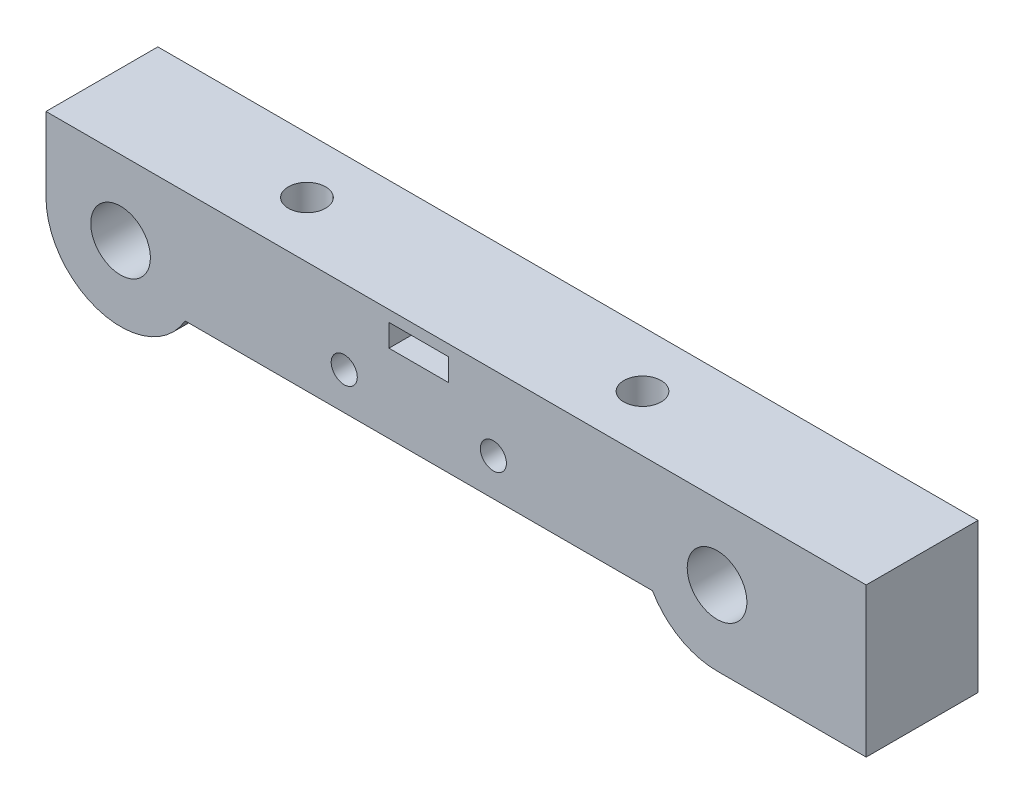
ISO-10303-21;
HEADER;
FILE_DESCRIPTION(('STEP AP214'),'2;1');
FILE_NAME('part.step','',(''),(''),'','','');
FILE_SCHEMA(('AUTOMOTIVE_DESIGN { 1 0 10303 214 1 1 1 1 }'));
ENDSEC;
DATA;
#1=APPLICATION_CONTEXT('core data for automotive mechanical design processes');
#2=APPLICATION_PROTOCOL_DEFINITION('international standard','automotive_design',2000,#1);
#3=PRODUCT_CONTEXT('',#1,'mechanical');
#4=PRODUCT('Part','Part','',(#3));
#5=PRODUCT_RELATED_PRODUCT_CATEGORY('part','',(#4));
#6=PRODUCT_DEFINITION_FORMATION('','',#4);
#7=PRODUCT_DEFINITION_CONTEXT('part definition',#1,'design');
#8=PRODUCT_DEFINITION('design','',#6,#7);
#9=PRODUCT_DEFINITION_SHAPE('','',#8);
#10=(LENGTH_UNIT() NAMED_UNIT(*) SI_UNIT(.MILLI.,.METRE.));
#11=(NAMED_UNIT(*) PLANE_ANGLE_UNIT() SI_UNIT($,.RADIAN.));
#12=(NAMED_UNIT(*) SI_UNIT($,.STERADIAN.) SOLID_ANGLE_UNIT());
#13=UNCERTAINTY_MEASURE_WITH_UNIT(LENGTH_MEASURE(1.E-05),#10,'distance_accuracy_value','');
#14=(GEOMETRIC_REPRESENTATION_CONTEXT(3) GLOBAL_UNCERTAINTY_ASSIGNED_CONTEXT((#13)) GLOBAL_UNIT_ASSIGNED_CONTEXT((#10,
#11,#12)) REPRESENTATION_CONTEXT('',''));
#15=CARTESIAN_POINT('',(0.,0.,0.));
#16=DIRECTION('',(0.,0.,1.));
#17=DIRECTION('',(1.,0.,0.));
#18=AXIS2_PLACEMENT_3D('',#15,#16,#17);
#19=CARTESIAN_POINT('',(40.,-9.99999999999999,15.));
#20=DIRECTION('',(0.,0.,-1.));
#21=DIRECTION('',(-1.,0.,0.));
#22=AXIS2_PLACEMENT_3D('',#19,#20,#21);
#23=PLANE('',#22);
#24=DIRECTION('',(-1.,0.,0.));
#25=VECTOR('',#24,1.);
#26=CARTESIAN_POINT('',(50.,0.,15.));
#27=LINE('',#26,#25);
#28=CARTESIAN_POINT('',(60.,0.,15.));
#29=VERTEX_POINT('',#28);
#30=CARTESIAN_POINT('',(-50.,0.,15.));
#31=VERTEX_POINT('',#30);
#32=EDGE_CURVE('E155',#29,#31,#27,.T.);
#33=ORIENTED_EDGE('',*,*,#32,.T.);
#34=DIRECTION('',(0.,-1.,0.));
#35=VECTOR('',#34,1.);
#36=CARTESIAN_POINT('',(-50.,-10.,15.));
#37=LINE('',#36,#35);
#38=CARTESIAN_POINT('',(-50.,-10.,15.));
#39=VERTEX_POINT('',#38);
#40=EDGE_CURVE('E157',#31,#39,#37,.T.);
#41=ORIENTED_EDGE('',*,*,#40,.T.);
#42=CARTESIAN_POINT('',(-40.,-10.,15.));
#43=DIRECTION('',(0.,0.,1.));
#44=DIRECTION('',(1.,0.,0.));
#45=AXIS2_PLACEMENT_3D('',#42,#43,#44);
#46=CIRCLE('',#45,10.);
#47=CARTESIAN_POINT('',(-31.3397459621556,-15.,15.));
#48=VERTEX_POINT('',#47);
#49=EDGE_CURVE('E160',#39,#48,#46,.T.);
#50=ORIENTED_EDGE('',*,*,#49,.T.);
#51=DIRECTION('',(1.,0.,0.));
#52=VECTOR('',#51,1.);
#53=CARTESIAN_POINT('',(-31.3397459621556,-15.,15.));
#54=LINE('',#53,#52);
#55=CARTESIAN_POINT('',(31.3397459621556,-15.,15.));
#56=VERTEX_POINT('',#55);
#57=EDGE_CURVE('E162',#48,#56,#54,.T.);
#58=ORIENTED_EDGE('',*,*,#57,.T.);
#59=CARTESIAN_POINT('',(40.,-9.99999999999999,15.));
#60=DIRECTION('',(0.,0.,1.));
#61=DIRECTION('',(-1.,0.,0.));
#62=AXIS2_PLACEMENT_3D('',#59,#60,#61);
#63=CIRCLE('',#62,10.);
#64=CARTESIAN_POINT('',(40.,-20.,15.));
#65=VERTEX_POINT('',#64);
#66=EDGE_CURVE('E164',#56,#65,#63,.T.);
#67=ORIENTED_EDGE('',*,*,#66,.T.);
#68=DIRECTION('',(1.,0.,0.));
#69=VECTOR('',#68,1.);
#70=CARTESIAN_POINT('',(60.,-20.,15.));
#71=LINE('',#70,#69);
#72=CARTESIAN_POINT('',(60.,-20.,15.));
#73=VERTEX_POINT('',#72);
#74=EDGE_CURVE('E166',#65,#73,#71,.T.);
#75=ORIENTED_EDGE('',*,*,#74,.T.);
#76=DIRECTION('',(0.,1.,0.));
#77=VECTOR('',#76,1.);
#78=CARTESIAN_POINT('',(60.,0.,15.));
#79=LINE('',#78,#77);
#80=EDGE_CURVE('E168',#73,#29,#79,.T.);
#81=ORIENTED_EDGE('',*,*,#80,.T.);
#82=EDGE_LOOP('',(#33,#41,#50,#58,#67,#75,#81));
#83=FACE_BOUND('',#82,.T.);
#84=DIRECTION('',(0.,-1.,0.));
#85=VECTOR('',#84,1.);
#86=CARTESIAN_POINT('',(-4.,-1.5,15.));
#87=LINE('',#86,#85);
#88=CARTESIAN_POINT('',(-4.,-1.5,15.));
#89=VERTEX_POINT('',#88);
#90=CARTESIAN_POINT('',(-4.,-4.5,15.));
#91=VERTEX_POINT('',#90);
#92=EDGE_CURVE('E116',#89,#91,#87,.T.);
#93=ORIENTED_EDGE('',*,*,#92,.F.);
#94=DIRECTION('',(-1.,0.,0.));
#95=VECTOR('',#94,1.);
#96=CARTESIAN_POINT('',(4.,-1.5,15.));
#97=LINE('',#96,#95);
#98=CARTESIAN_POINT('',(4.,-1.5,15.));
#99=VERTEX_POINT('',#98);
#100=EDGE_CURVE('E139',#99,#89,#97,.T.);
#101=ORIENTED_EDGE('',*,*,#100,.F.);
#102=DIRECTION('',(0.,1.,0.));
#103=VECTOR('',#102,1.);
#104=CARTESIAN_POINT('',(4.,-1.5,15.));
#105=LINE('',#104,#103);
#106=CARTESIAN_POINT('',(4.,-4.5,15.));
#107=VERTEX_POINT('',#106);
#108=EDGE_CURVE('E137',#107,#99,#105,.T.);
#109=ORIENTED_EDGE('',*,*,#108,.F.);
#110=DIRECTION('',(1.,0.,0.));
#111=VECTOR('',#110,1.);
#112=CARTESIAN_POINT('',(4.,-4.5,15.));
#113=LINE('',#112,#111);
#114=EDGE_CURVE('E124',#91,#107,#113,.T.);
#115=ORIENTED_EDGE('',*,*,#114,.F.);
#116=EDGE_LOOP('',(#93,#101,#109,#115));
#117=FACE_BOUND('',#116,.T.);
#118=CARTESIAN_POINT('',(-40.,-10.,15.));
#119=DIRECTION('',(0.,0.,1.));
#120=DIRECTION('',(1.,0.,0.));
#121=AXIS2_PLACEMENT_3D('',#118,#119,#120);
#122=CIRCLE('',#121,4.);
#123=CARTESIAN_POINT('',(-36.,-10.,15.));
#124=VERTEX_POINT('',#123);
#125=EDGE_CURVE('E145',#124,#124,#122,.T.);
#126=ORIENTED_EDGE('',*,*,#125,.F.);
#127=EDGE_LOOP('',(#126));
#128=FACE_BOUND('',#127,.T.);
#129=CARTESIAN_POINT('',(40.,-9.99999999999999,15.));
#130=DIRECTION('',(0.,0.,1.));
#131=DIRECTION('',(-1.,0.,0.));
#132=AXIS2_PLACEMENT_3D('',#129,#130,#131);
#133=CIRCLE('',#132,4.);
#134=CARTESIAN_POINT('',(36.,-9.99999999999999,15.));
#135=VERTEX_POINT('',#134);
#136=EDGE_CURVE('E317',#135,#135,#133,.T.);
#137=ORIENTED_EDGE('',*,*,#136,.F.);
#138=EDGE_LOOP('',(#137));
#139=FACE_BOUND('',#138,.T.);
#140=CARTESIAN_POINT('',(10.,-10.,15.));
#141=DIRECTION('',(0.,0.,1.));
#142=DIRECTION('',(1.,0.,0.));
#143=AXIS2_PLACEMENT_3D('',#140,#141,#142);
#144=CIRCLE('',#143,1.75);
#145=CARTESIAN_POINT('',(11.75,-10.,15.));
#146=VERTEX_POINT('',#145);
#147=EDGE_CURVE('E311',#146,#146,#144,.T.);
#148=ORIENTED_EDGE('',*,*,#147,.F.);
#149=EDGE_LOOP('',(#148));
#150=FACE_BOUND('',#149,.T.);
#151=CARTESIAN_POINT('',(-10.,-10.,15.));
#152=DIRECTION('',(0.,0.,1.));
#153=DIRECTION('',(1.,0.,0.));
#154=AXIS2_PLACEMENT_3D('',#151,#152,#153);
#155=CIRCLE('',#154,1.75);
#156=CARTESIAN_POINT('',(-8.25,-10.,15.));
#157=VERTEX_POINT('',#156);
#158=EDGE_CURVE('E305',#157,#157,#155,.T.);
#159=ORIENTED_EDGE('',*,*,#158,.F.);
#160=EDGE_LOOP('',(#159));
#161=FACE_BOUND('',#160,.T.);
#162=ADVANCED_FACE('F33',(#83,#117,#128,#139,#150,#161),#23,.F.);
#163=CARTESIAN_POINT('',(40.,-9.99999999999999,0.));
#164=DIRECTION('',(0.,0.,-1.));
#165=DIRECTION('',(-1.,0.,0.));
#166=AXIS2_PLACEMENT_3D('',#163,#164,#165);
#167=PLANE('',#166);
#168=CARTESIAN_POINT('',(10.,-10.,0.));
#169=DIRECTION('',(0.,0.,1.));
#170=DIRECTION('',(1.,0.,0.));
#171=AXIS2_PLACEMENT_3D('',#168,#169,#170);
#172=CIRCLE('',#171,1.75);
#173=CARTESIAN_POINT('',(11.75,-10.,0.));
#174=VERTEX_POINT('',#173);
#175=EDGE_CURVE('E308',#174,#174,#172,.T.);
#176=ORIENTED_EDGE('',*,*,#175,.T.);
#177=EDGE_LOOP('',(#176));
#178=FACE_BOUND('',#177,.T.);
#179=CARTESIAN_POINT('',(-40.,-10.,0.));
#180=DIRECTION('',(0.,0.,1.));
#181=DIRECTION('',(1.,0.,0.));
#182=AXIS2_PLACEMENT_3D('',#179,#180,#181);
#183=CIRCLE('',#182,4.);
#184=CARTESIAN_POINT('',(-36.,-10.,0.));
#185=VERTEX_POINT('',#184);
#186=EDGE_CURVE('E320',#185,#185,#183,.T.);
#187=ORIENTED_EDGE('',*,*,#186,.T.);
#188=EDGE_LOOP('',(#187));
#189=FACE_BOUND('',#188,.T.);
#190=DIRECTION('',(-1.,0.,0.));
#191=VECTOR('',#190,1.);
#192=CARTESIAN_POINT('',(-50.,0.,0.));
#193=LINE('',#192,#191);
#194=CARTESIAN_POINT('',(60.,0.,0.));
#195=VERTEX_POINT('',#194);
#196=CARTESIAN_POINT('',(-50.,0.,0.));
#197=VERTEX_POINT('',#196);
#198=EDGE_CURVE('E132',#195,#197,#193,.T.);
#199=ORIENTED_EDGE('',*,*,#198,.F.);
#200=DIRECTION('',(0.,1.,0.));
#201=VECTOR('',#200,1.);
#202=CARTESIAN_POINT('',(60.,0.,0.));
#203=LINE('',#202,#201);
#204=CARTESIAN_POINT('',(60.,-20.,0.));
#205=VERTEX_POINT('',#204);
#206=EDGE_CURVE('E158',#205,#195,#203,.T.);
#207=ORIENTED_EDGE('',*,*,#206,.F.);
#208=DIRECTION('',(1.,0.,0.));
#209=VECTOR('',#208,1.);
#210=CARTESIAN_POINT('',(60.,-20.,0.));
#211=LINE('',#210,#209);
#212=CARTESIAN_POINT('',(40.,-20.,0.));
#213=VERTEX_POINT('',#212);
#214=EDGE_CURVE('E180',#213,#205,#211,.T.);
#215=ORIENTED_EDGE('',*,*,#214,.F.);
#216=CARTESIAN_POINT('',(40.,-9.99999999999999,0.));
#217=DIRECTION('',(0.,0.,1.));
#218=DIRECTION('',(-1.,0.,0.));
#219=AXIS2_PLACEMENT_3D('',#216,#217,#218);
#220=CIRCLE('',#219,10.);
#221=CARTESIAN_POINT('',(31.3397459621556,-15.,0.));
#222=VERTEX_POINT('',#221);
#223=EDGE_CURVE('E178',#222,#213,#220,.T.);
#224=ORIENTED_EDGE('',*,*,#223,.F.);
#225=DIRECTION('',(1.,0.,0.));
#226=VECTOR('',#225,1.);
#227=CARTESIAN_POINT('',(-31.3397459621556,-15.,0.));
#228=LINE('',#227,#226);
#229=CARTESIAN_POINT('',(-31.3397459621556,-15.,0.));
#230=VERTEX_POINT('',#229);
#231=EDGE_CURVE('E176',#230,#222,#228,.T.);
#232=ORIENTED_EDGE('',*,*,#231,.F.);
#233=CARTESIAN_POINT('',(-40.,-10.,0.));
#234=DIRECTION('',(0.,0.,1.));
#235=DIRECTION('',(1.,0.,0.));
#236=AXIS2_PLACEMENT_3D('',#233,#234,#235);
#237=CIRCLE('',#236,10.);
#238=CARTESIAN_POINT('',(-50.,-10.,0.));
#239=VERTEX_POINT('',#238);
#240=EDGE_CURVE('E174',#239,#230,#237,.T.);
#241=ORIENTED_EDGE('',*,*,#240,.F.);
#242=DIRECTION('',(0.,-1.,0.));
#243=VECTOR('',#242,1.);
#244=CARTESIAN_POINT('',(-50.,-10.,0.));
#245=LINE('',#244,#243);
#246=EDGE_CURVE('E172',#197,#239,#245,.T.);
#247=ORIENTED_EDGE('',*,*,#246,.F.);
#248=EDGE_LOOP('',(#199,#207,#215,#224,#232,#241,#247));
#249=FACE_BOUND('',#248,.T.);
#250=DIRECTION('',(-1.,0.,0.));
#251=VECTOR('',#250,1.);
#252=CARTESIAN_POINT('',(4.,-1.5,0.));
#253=LINE('',#252,#251);
#254=CARTESIAN_POINT('',(4.,-1.5,0.));
#255=VERTEX_POINT('',#254);
#256=CARTESIAN_POINT('',(-4.,-1.5,0.));
#257=VERTEX_POINT('',#256);
#258=EDGE_CURVE('E125',#255,#257,#253,.T.);
#259=ORIENTED_EDGE('',*,*,#258,.T.);
#260=DIRECTION('',(0.,-1.,0.));
#261=VECTOR('',#260,1.);
#262=CARTESIAN_POINT('',(-4.,-1.5,0.));
#263=LINE('',#262,#261);
#264=CARTESIAN_POINT('',(-4.,-4.5,0.));
#265=VERTEX_POINT('',#264);
#266=EDGE_CURVE('E56',#257,#265,#263,.T.);
#267=ORIENTED_EDGE('',*,*,#266,.T.);
#268=DIRECTION('',(1.,0.,0.));
#269=VECTOR('',#268,1.);
#270=CARTESIAN_POINT('',(4.,-4.5,0.));
#271=LINE('',#270,#269);
#272=CARTESIAN_POINT('',(4.,-4.5,0.));
#273=VERTEX_POINT('',#272);
#274=EDGE_CURVE('E131',#265,#273,#271,.T.);
#275=ORIENTED_EDGE('',*,*,#274,.T.);
#276=DIRECTION('',(0.,1.,0.));
#277=VECTOR('',#276,1.);
#278=CARTESIAN_POINT('',(4.,-1.5,0.));
#279=LINE('',#278,#277);
#280=EDGE_CURVE('E147',#273,#255,#279,.T.);
#281=ORIENTED_EDGE('',*,*,#280,.T.);
#282=EDGE_LOOP('',(#259,#267,#275,#281));
#283=FACE_BOUND('',#282,.T.);
#284=CARTESIAN_POINT('',(40.,-9.99999999999999,0.));
#285=DIRECTION('',(0.,0.,1.));
#286=DIRECTION('',(-1.,0.,0.));
#287=AXIS2_PLACEMENT_3D('',#284,#285,#286);
#288=CIRCLE('',#287,4.);
#289=CARTESIAN_POINT('',(36.,-9.99999999999999,0.));
#290=VERTEX_POINT('',#289);
#291=EDGE_CURVE('E314',#290,#290,#288,.T.);
#292=ORIENTED_EDGE('',*,*,#291,.T.);
#293=EDGE_LOOP('',(#292));
#294=FACE_BOUND('',#293,.T.);
#295=CARTESIAN_POINT('',(-10.,-10.,0.));
#296=DIRECTION('',(0.,0.,1.));
#297=DIRECTION('',(1.,0.,0.));
#298=AXIS2_PLACEMENT_3D('',#295,#296,#297);
#299=CIRCLE('',#298,1.75);
#300=CARTESIAN_POINT('',(-8.25,-10.,0.));
#301=VERTEX_POINT('',#300);
#302=EDGE_CURVE('E303',#301,#301,#299,.T.);
#303=ORIENTED_EDGE('',*,*,#302,.T.);
#304=EDGE_LOOP('',(#303));
#305=FACE_BOUND('',#304,.T.);
#306=ADVANCED_FACE('F209',(#178,#189,#249,#283,#294,#305),#167,.T.);
#307=CARTESIAN_POINT('',(-50.,0.,15.));
#308=DIRECTION('',(0.,-1.,0.));
#309=DIRECTION('',(1.,0.,0.));
#310=AXIS2_PLACEMENT_3D('',#307,#308,#309);
#311=PLANE('',#310);
#312=CARTESIAN_POINT('',(-22.5,0.,7.5));
#313=DIRECTION('',(0.,-1.,0.));
#314=DIRECTION('',(1.,0.,0.));
#315=AXIS2_PLACEMENT_3D('',#312,#313,#314);
#316=CIRCLE('',#315,2.5);
#317=CARTESIAN_POINT('',(-20.,0.,7.5));
#318=VERTEX_POINT('',#317);
#319=EDGE_CURVE('E290',#318,#318,#316,.T.);
#320=ORIENTED_EDGE('',*,*,#319,.T.);
#321=EDGE_LOOP('',(#320));
#322=FACE_BOUND('',#321,.T.);
#323=CARTESIAN_POINT('',(22.5,0.,7.5));
#324=DIRECTION('',(0.,-1.,0.));
#325=DIRECTION('',(1.,0.,0.));
#326=AXIS2_PLACEMENT_3D('',#323,#324,#325);
#327=CIRCLE('',#326,2.5);
#328=CARTESIAN_POINT('',(25.,0.,7.5));
#329=VERTEX_POINT('',#328);
#330=EDGE_CURVE('E298',#329,#329,#327,.F.);
#331=ORIENTED_EDGE('',*,*,#330,.F.);
#332=EDGE_LOOP('',(#331));
#333=FACE_BOUND('',#332,.T.);
#334=ORIENTED_EDGE('',*,*,#198,.T.);
#335=DIRECTION('',(0.,0.,-1.));
#336=VECTOR('',#335,1.);
#337=CARTESIAN_POINT('',(-50.,0.,15.));
#338=LINE('',#337,#336);
#339=EDGE_CURVE('E11',#31,#197,#338,.T.);
#340=ORIENTED_EDGE('',*,*,#339,.F.);
#341=ORIENTED_EDGE('',*,*,#32,.F.);
#342=DIRECTION('',(0.,0.,-1.));
#343=VECTOR('',#342,1.);
#344=CARTESIAN_POINT('',(60.,0.,15.));
#345=LINE('',#344,#343);
#346=EDGE_CURVE('E170',#29,#195,#345,.T.);
#347=ORIENTED_EDGE('',*,*,#346,.T.);
#348=EDGE_LOOP('',(#334,#340,#341,#347));
#349=FACE_BOUND('',#348,.T.);
#350=ADVANCED_FACE('F35',(#322,#333,#349),#311,.F.);
#351=CARTESIAN_POINT('',(-50.,-10.,15.));
#352=DIRECTION('',(1.,0.,0.));
#353=DIRECTION('',(0.,0.,-1.));
#354=AXIS2_PLACEMENT_3D('',#351,#352,#353);
#355=PLANE('',#354);
#356=ORIENTED_EDGE('',*,*,#246,.T.);
#357=DIRECTION('',(0.,0.,-1.));
#358=VECTOR('',#357,1.);
#359=CARTESIAN_POINT('',(-50.,-10.,15.));
#360=LINE('',#359,#358);
#361=EDGE_CURVE('E41',#39,#239,#360,.T.);
#362=ORIENTED_EDGE('',*,*,#361,.F.);
#363=ORIENTED_EDGE('',*,*,#40,.F.);
#364=ORIENTED_EDGE('',*,*,#339,.T.);
#365=EDGE_LOOP('',(#356,#362,#363,#364));
#366=FACE_BOUND('',#365,.T.);
#367=ADVANCED_FACE('F226',(#366),#355,.F.);
#368=CARTESIAN_POINT('',(-40.,-10.,15.));
#369=DIRECTION('',(0.,0.,-1.));
#370=DIRECTION('',(-1.,0.,0.));
#371=AXIS2_PLACEMENT_3D('',#368,#369,#370);
#372=CYLINDRICAL_SURFACE('',#371,10.);
#373=ORIENTED_EDGE('',*,*,#240,.T.);
#374=DIRECTION('',(0.,0.,-1.));
#375=VECTOR('',#374,1.);
#376=CARTESIAN_POINT('',(-31.3397459621556,-15.,15.));
#377=LINE('',#376,#375);
#378=EDGE_CURVE('E195',#48,#230,#377,.T.);
#379=ORIENTED_EDGE('',*,*,#378,.F.);
#380=ORIENTED_EDGE('',*,*,#49,.F.);
#381=ORIENTED_EDGE('',*,*,#361,.T.);
#382=EDGE_LOOP('',(#373,#379,#380,#381));
#383=FACE_BOUND('',#382,.T.);
#384=ADVANCED_FACE('F202',(#383),#372,.T.);
#385=CARTESIAN_POINT('',(-31.3397459621556,-15.,15.));
#386=DIRECTION('',(0.,1.,0.));
#387=DIRECTION('',(-1.,0.,0.));
#388=AXIS2_PLACEMENT_3D('',#385,#386,#387);
#389=PLANE('',#388);
#390=CARTESIAN_POINT('',(-22.5,-15.,7.5));
#391=DIRECTION('',(0.,-1.,0.));
#392=DIRECTION('',(1.,0.,0.));
#393=AXIS2_PLACEMENT_3D('',#390,#391,#392);
#394=CIRCLE('',#393,2.5);
#395=CARTESIAN_POINT('',(-20.,-15.,7.5));
#396=VERTEX_POINT('',#395);
#397=EDGE_CURVE('E293',#396,#396,#394,.T.);
#398=ORIENTED_EDGE('',*,*,#397,.F.);
#399=EDGE_LOOP('',(#398));
#400=FACE_BOUND('',#399,.T.);
#401=CARTESIAN_POINT('',(22.5,-15.,7.5));
#402=DIRECTION('',(0.,-1.,0.));
#403=DIRECTION('',(1.,0.,0.));
#404=AXIS2_PLACEMENT_3D('',#401,#402,#403);
#405=CIRCLE('',#404,2.5);
#406=CARTESIAN_POINT('',(25.,-15.,7.5));
#407=VERTEX_POINT('',#406);
#408=EDGE_CURVE('E295',#407,#407,#405,.F.);
#409=ORIENTED_EDGE('',*,*,#408,.T.);
#410=EDGE_LOOP('',(#409));
#411=FACE_BOUND('',#410,.T.);
#412=ORIENTED_EDGE('',*,*,#231,.T.);
#413=DIRECTION('',(0.,0.,-1.));
#414=VECTOR('',#413,1.);
#415=CARTESIAN_POINT('',(31.3397459621556,-15.,15.));
#416=LINE('',#415,#414);
#417=EDGE_CURVE('E192',#56,#222,#416,.T.);
#418=ORIENTED_EDGE('',*,*,#417,.F.);
#419=ORIENTED_EDGE('',*,*,#57,.F.);
#420=ORIENTED_EDGE('',*,*,#378,.T.);
#421=EDGE_LOOP('',(#412,#418,#419,#420));
#422=FACE_BOUND('',#421,.T.);
#423=ADVANCED_FACE('F215',(#400,#411,#422),#389,.F.);
#424=CARTESIAN_POINT('',(40.,-9.99999999999999,15.));
#425=DIRECTION('',(0.,0.,-1.));
#426=DIRECTION('',(-1.,0.,0.));
#427=AXIS2_PLACEMENT_3D('',#424,#425,#426);
#428=CYLINDRICAL_SURFACE('',#427,10.);
#429=ORIENTED_EDGE('',*,*,#223,.T.);
#430=DIRECTION('',(0.,0.,-1.));
#431=VECTOR('',#430,1.);
#432=CARTESIAN_POINT('',(40.,-20.,15.));
#433=LINE('',#432,#431);
#434=EDGE_CURVE('E189',#65,#213,#433,.T.);
#435=ORIENTED_EDGE('',*,*,#434,.F.);
#436=ORIENTED_EDGE('',*,*,#66,.F.);
#437=ORIENTED_EDGE('',*,*,#417,.T.);
#438=EDGE_LOOP('',(#429,#435,#436,#437));
#439=FACE_BOUND('',#438,.T.);
#440=ADVANCED_FACE('F219',(#439),#428,.T.);
#441=CARTESIAN_POINT('',(60.,-20.,15.));
#442=DIRECTION('',(0.,1.,0.));
#443=DIRECTION('',(-1.,0.,0.));
#444=AXIS2_PLACEMENT_3D('',#441,#442,#443);
#445=PLANE('',#444);
#446=ORIENTED_EDGE('',*,*,#214,.T.);
#447=DIRECTION('',(0.,0.,-1.));
#448=VECTOR('',#447,1.);
#449=CARTESIAN_POINT('',(60.,-20.,15.));
#450=LINE('',#449,#448);
#451=EDGE_CURVE('E186',#73,#205,#450,.T.);
#452=ORIENTED_EDGE('',*,*,#451,.F.);
#453=ORIENTED_EDGE('',*,*,#74,.F.);
#454=ORIENTED_EDGE('',*,*,#434,.T.);
#455=EDGE_LOOP('',(#446,#452,#453,#454));
#456=FACE_BOUND('',#455,.T.);
#457=ADVANCED_FACE('F234',(#456),#445,.F.);
#458=CARTESIAN_POINT('',(60.,0.,15.));
#459=DIRECTION('',(-1.,0.,0.));
#460=DIRECTION('',(0.,0.,1.));
#461=AXIS2_PLACEMENT_3D('',#458,#459,#460);
#462=PLANE('',#461);
#463=ORIENTED_EDGE('',*,*,#206,.T.);
#464=ORIENTED_EDGE('',*,*,#346,.F.);
#465=ORIENTED_EDGE('',*,*,#80,.F.);
#466=ORIENTED_EDGE('',*,*,#451,.T.);
#467=EDGE_LOOP('',(#463,#464,#465,#466));
#468=FACE_BOUND('',#467,.T.);
#469=ADVANCED_FACE('F231',(#468),#462,.F.);
#470=CARTESIAN_POINT('',(-4.,-1.5,15.));
#471=DIRECTION('',(1.,0.,0.));
#472=DIRECTION('',(0.,1.,0.));
#473=AXIS2_PLACEMENT_3D('',#470,#471,#472);
#474=PLANE('',#473);
#475=ORIENTED_EDGE('',*,*,#266,.F.);
#476=DIRECTION('',(0.,0.,-1.));
#477=VECTOR('',#476,1.);
#478=CARTESIAN_POINT('',(-4.,-1.5,15.));
#479=LINE('',#478,#477);
#480=EDGE_CURVE('E120',#89,#257,#479,.T.);
#481=ORIENTED_EDGE('',*,*,#480,.F.);
#482=ORIENTED_EDGE('',*,*,#92,.T.);
#483=DIRECTION('',(0.,0.,-1.));
#484=VECTOR('',#483,1.);
#485=CARTESIAN_POINT('',(-4.,-4.5,15.));
#486=LINE('',#485,#484);
#487=EDGE_CURVE('E119',#91,#265,#486,.T.);
#488=ORIENTED_EDGE('',*,*,#487,.T.);
#489=EDGE_LOOP('',(#475,#481,#482,#488));
#490=FACE_BOUND('',#489,.T.);
#491=ADVANCED_FACE('F118',(#490),#474,.T.);
#492=CARTESIAN_POINT('',(4.,-4.5,15.));
#493=DIRECTION('',(0.,1.,0.));
#494=DIRECTION('',(0.,0.,1.));
#495=AXIS2_PLACEMENT_3D('',#492,#493,#494);
#496=PLANE('',#495);
#497=ORIENTED_EDGE('',*,*,#274,.F.);
#498=ORIENTED_EDGE('',*,*,#487,.F.);
#499=ORIENTED_EDGE('',*,*,#114,.T.);
#500=DIRECTION('',(0.,0.,-1.));
#501=VECTOR('',#500,1.);
#502=CARTESIAN_POINT('',(4.,-4.5,15.));
#503=LINE('',#502,#501);
#504=EDGE_CURVE('E133',#107,#273,#503,.T.);
#505=ORIENTED_EDGE('',*,*,#504,.T.);
#506=EDGE_LOOP('',(#497,#498,#499,#505));
#507=FACE_BOUND('',#506,.T.);
#508=ADVANCED_FACE('F128',(#507),#496,.T.);
#509=CARTESIAN_POINT('',(4.,-1.5,15.));
#510=DIRECTION('',(-1.,0.,0.));
#511=DIRECTION('',(0.,-1.,0.));
#512=AXIS2_PLACEMENT_3D('',#509,#510,#511);
#513=PLANE('',#512);
#514=ORIENTED_EDGE('',*,*,#280,.F.);
#515=ORIENTED_EDGE('',*,*,#504,.F.);
#516=ORIENTED_EDGE('',*,*,#108,.T.);
#517=DIRECTION('',(0.,0.,-1.));
#518=VECTOR('',#517,1.);
#519=CARTESIAN_POINT('',(4.,-1.5,15.));
#520=LINE('',#519,#518);
#521=EDGE_CURVE('E48',#99,#255,#520,.T.);
#522=ORIENTED_EDGE('',*,*,#521,.T.);
#523=EDGE_LOOP('',(#514,#515,#516,#522));
#524=FACE_BOUND('',#523,.T.);
#525=ADVANCED_FACE('F255',(#524),#513,.T.);
#526=CARTESIAN_POINT('',(4.,-1.5,15.));
#527=DIRECTION('',(0.,-1.,0.));
#528=DIRECTION('',(1.,0.,0.));
#529=AXIS2_PLACEMENT_3D('',#526,#527,#528);
#530=PLANE('',#529);
#531=ORIENTED_EDGE('',*,*,#258,.F.);
#532=ORIENTED_EDGE('',*,*,#521,.F.);
#533=ORIENTED_EDGE('',*,*,#100,.T.);
#534=ORIENTED_EDGE('',*,*,#480,.T.);
#535=EDGE_LOOP('',(#531,#532,#533,#534));
#536=FACE_BOUND('',#535,.T.);
#537=ADVANCED_FACE('F258',(#536),#530,.T.);
#538=CARTESIAN_POINT('',(-40.,-10.,15.));
#539=DIRECTION('',(0.,0.,-1.));
#540=DIRECTION('',(-1.,0.,0.));
#541=AXIS2_PLACEMENT_3D('',#538,#539,#540);
#542=CYLINDRICAL_SURFACE('',#541,4.);
#543=ORIENTED_EDGE('',*,*,#125,.T.);
#544=EDGE_LOOP('',(#543));
#545=FACE_BOUND('',#544,.T.);
#546=ORIENTED_EDGE('',*,*,#186,.F.);
#547=EDGE_LOOP('',(#546));
#548=FACE_BOUND('',#547,.T.);
#549=ADVANCED_FACE('F262',(#545,#548),#542,.F.);
#550=CARTESIAN_POINT('',(40.,-9.99999999999999,15.));
#551=DIRECTION('',(0.,0.,-1.));
#552=DIRECTION('',(-1.,0.,0.));
#553=AXIS2_PLACEMENT_3D('',#550,#551,#552);
#554=CYLINDRICAL_SURFACE('',#553,4.);
#555=ORIENTED_EDGE('',*,*,#136,.T.);
#556=EDGE_LOOP('',(#555));
#557=FACE_BOUND('',#556,.T.);
#558=ORIENTED_EDGE('',*,*,#291,.F.);
#559=EDGE_LOOP('',(#558));
#560=FACE_BOUND('',#559,.T.);
#561=ADVANCED_FACE('F265',(#557,#560),#554,.F.);
#562=CARTESIAN_POINT('',(10.,-10.,15.));
#563=DIRECTION('',(0.,0.,-1.));
#564=DIRECTION('',(-1.,0.,0.));
#565=AXIS2_PLACEMENT_3D('',#562,#563,#564);
#566=CYLINDRICAL_SURFACE('',#565,1.75);
#567=ORIENTED_EDGE('',*,*,#147,.T.);
#568=EDGE_LOOP('',(#567));
#569=FACE_BOUND('',#568,.T.);
#570=ORIENTED_EDGE('',*,*,#175,.F.);
#571=EDGE_LOOP('',(#570));
#572=FACE_BOUND('',#571,.T.);
#573=ADVANCED_FACE('F269',(#569,#572),#566,.F.);
#574=CARTESIAN_POINT('',(-10.,-10.,15.));
#575=DIRECTION('',(0.,0.,-1.));
#576=DIRECTION('',(-1.,0.,0.));
#577=AXIS2_PLACEMENT_3D('',#574,#575,#576);
#578=CYLINDRICAL_SURFACE('',#577,1.75);
#579=ORIENTED_EDGE('',*,*,#158,.T.);
#580=EDGE_LOOP('',(#579));
#581=FACE_BOUND('',#580,.T.);
#582=ORIENTED_EDGE('',*,*,#302,.F.);
#583=EDGE_LOOP('',(#582));
#584=FACE_BOUND('',#583,.T.);
#585=ADVANCED_FACE('F273',(#581,#584),#578,.F.);
#586=CARTESIAN_POINT('',(22.5,0.,7.5));
#587=DIRECTION('',(0.,-1.,0.));
#588=DIRECTION('',(1.,0.,0.));
#589=AXIS2_PLACEMENT_3D('',#586,#587,#588);
#590=CYLINDRICAL_SURFACE('',#589,2.5);
#591=ORIENTED_EDGE('',*,*,#330,.T.);
#592=EDGE_LOOP('',(#591));
#593=FACE_BOUND('',#592,.T.);
#594=ORIENTED_EDGE('',*,*,#408,.F.);
#595=EDGE_LOOP('',(#594));
#596=FACE_BOUND('',#595,.T.);
#597=ADVANCED_FACE('F277',(#593,#596),#590,.F.);
#598=CARTESIAN_POINT('',(-22.5,0.,7.5));
#599=DIRECTION('',(0.,-1.,0.));
#600=DIRECTION('',(1.,0.,0.));
#601=AXIS2_PLACEMENT_3D('',#598,#599,#600);
#602=CYLINDRICAL_SURFACE('',#601,2.5);
#603=ORIENTED_EDGE('',*,*,#319,.F.);
#604=EDGE_LOOP('',(#603));
#605=FACE_BOUND('',#604,.T.);
#606=ORIENTED_EDGE('',*,*,#397,.T.);
#607=EDGE_LOOP('',(#606));
#608=FACE_BOUND('',#607,.T.);
#609=ADVANCED_FACE('F281',(#605,#608),#602,.F.);
#610=CLOSED_SHELL('',(#162,#306,#350,#367,#384,#423,#440,#457,#469,#491,#508,#525,#537,#549,
#561,#573,#585,#597,#609));
#611=MANIFOLD_SOLID_BREP('B2',#610);
#612=ADVANCED_BREP_SHAPE_REPRESENTATION('',(#18,#611),#14);
#613=SHAPE_DEFINITION_REPRESENTATION(#9,#612);
ENDSEC;
END-ISO-10303-21;
